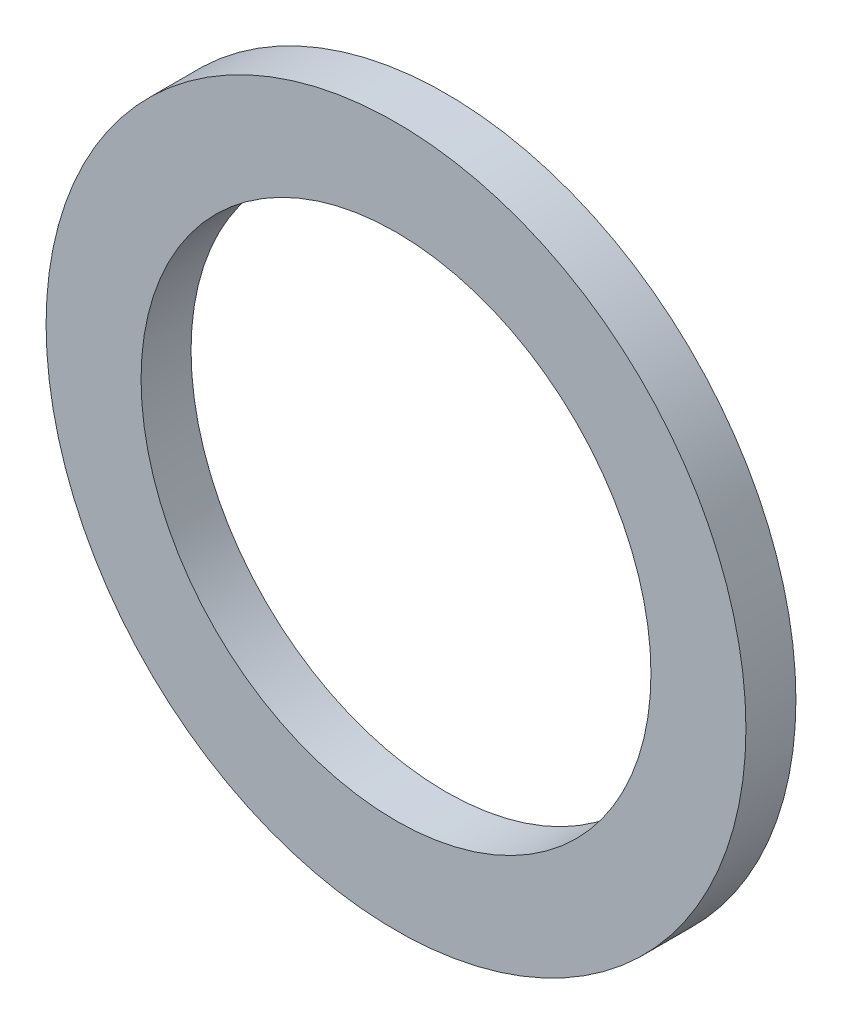
ISO-10303-21;
HEADER;
FILE_DESCRIPTION(('STEP AP214'),'2;1');
FILE_NAME('part.step','',(''),(''),'','','');
FILE_SCHEMA(('AUTOMOTIVE_DESIGN { 1 0 10303 214 1 1 1 1 }'));
ENDSEC;
DATA;
#1=APPLICATION_CONTEXT('core data for automotive mechanical design processes');
#2=APPLICATION_PROTOCOL_DEFINITION('international standard','automotive_design',2000,#1);
#3=PRODUCT_CONTEXT('',#1,'mechanical');
#4=PRODUCT('Part','Part','',(#3));
#5=PRODUCT_RELATED_PRODUCT_CATEGORY('part','',(#4));
#6=PRODUCT_DEFINITION_FORMATION('','',#4);
#7=PRODUCT_DEFINITION_CONTEXT('part definition',#1,'design');
#8=PRODUCT_DEFINITION('design','',#6,#7);
#9=PRODUCT_DEFINITION_SHAPE('','',#8);
#10=(LENGTH_UNIT() NAMED_UNIT(*) SI_UNIT(.MILLI.,.METRE.));
#11=(NAMED_UNIT(*) PLANE_ANGLE_UNIT() SI_UNIT($,.RADIAN.));
#12=(NAMED_UNIT(*) SI_UNIT($,.STERADIAN.) SOLID_ANGLE_UNIT());
#13=UNCERTAINTY_MEASURE_WITH_UNIT(LENGTH_MEASURE(1.E-05),#10,'distance_accuracy_value','');
#14=(GEOMETRIC_REPRESENTATION_CONTEXT(3) GLOBAL_UNCERTAINTY_ASSIGNED_CONTEXT((#13)) GLOBAL_UNIT_ASSIGNED_CONTEXT((#10,
#11,#12)) REPRESENTATION_CONTEXT('',''));
#15=CARTESIAN_POINT('',(0.,0.,0.));
#16=DIRECTION('',(0.,0.,1.));
#17=DIRECTION('',(1.,0.,0.));
#18=AXIS2_PLACEMENT_3D('',#15,#16,#17);
#19=CARTESIAN_POINT('',(0.,0.,1.));
#20=DIRECTION('',(0.,0.,1.));
#21=DIRECTION('',(1.,0.,0.));
#22=AXIS2_PLACEMENT_3D('',#19,#20,#21);
#23=PLANE('',#22);
#24=CARTESIAN_POINT('',(0.,0.,1.));
#25=DIRECTION('',(0.,0.,1.));
#26=DIRECTION('',(1.,0.,0.));
#27=AXIS2_PLACEMENT_3D('',#24,#25,#26);
#28=CIRCLE('',#27,7.);
#29=CARTESIAN_POINT('',(7.,0.,1.));
#30=VERTEX_POINT('',#29);
#31=EDGE_CURVE('E10',#30,#30,#28,.T.);
#32=ORIENTED_EDGE('',*,*,#31,.T.);
#33=EDGE_LOOP('',(#32));
#34=FACE_BOUND('',#33,.T.);
#35=CARTESIAN_POINT('',(0.,0.,1.));
#36=DIRECTION('',(0.,0.,1.));
#37=DIRECTION('',(1.,0.,0.));
#38=AXIS2_PLACEMENT_3D('',#35,#36,#37);
#39=CIRCLE('',#38,5.1);
#40=CARTESIAN_POINT('',(5.1,0.,1.));
#41=VERTEX_POINT('',#40);
#42=EDGE_CURVE('E45',#41,#41,#39,.T.);
#43=ORIENTED_EDGE('',*,*,#42,.F.);
#44=EDGE_LOOP('',(#43));
#45=FACE_BOUND('',#44,.T.);
#46=ADVANCED_FACE('F34',(#34,#45),#23,.T.);
#47=CARTESIAN_POINT('',(0.,0.,0.));
#48=DIRECTION('',(0.,0.,1.));
#49=DIRECTION('',(1.,0.,0.));
#50=AXIS2_PLACEMENT_3D('',#47,#48,#49);
#51=PLANE('',#50);
#52=CARTESIAN_POINT('',(0.,0.,0.));
#53=DIRECTION('',(0.,0.,1.));
#54=DIRECTION('',(1.,0.,0.));
#55=AXIS2_PLACEMENT_3D('',#52,#53,#54);
#56=CIRCLE('',#55,7.);
#57=CARTESIAN_POINT('',(7.,0.,0.));
#58=VERTEX_POINT('',#57);
#59=EDGE_CURVE('E38',#58,#58,#56,.T.);
#60=ORIENTED_EDGE('',*,*,#59,.F.);
#61=EDGE_LOOP('',(#60));
#62=FACE_BOUND('',#61,.T.);
#63=CARTESIAN_POINT('',(0.,0.,0.));
#64=DIRECTION('',(0.,0.,1.));
#65=DIRECTION('',(1.,0.,0.));
#66=AXIS2_PLACEMENT_3D('',#63,#64,#65);
#67=CIRCLE('',#66,5.1);
#68=CARTESIAN_POINT('',(5.1,0.,0.));
#69=VERTEX_POINT('',#68);
#70=EDGE_CURVE('E47',#69,#69,#67,.T.);
#71=ORIENTED_EDGE('',*,*,#70,.T.);
#72=EDGE_LOOP('',(#71));
#73=FACE_BOUND('',#72,.T.);
#74=ADVANCED_FACE('F57',(#62,#73),#51,.F.);
#75=CARTESIAN_POINT('',(0.,0.,1.));
#76=DIRECTION('',(0.,0.,-1.));
#77=DIRECTION('',(-1.,0.,0.));
#78=AXIS2_PLACEMENT_3D('',#75,#76,#77);
#79=CYLINDRICAL_SURFACE('',#78,7.);
#80=ORIENTED_EDGE('',*,*,#31,.F.);
#81=EDGE_LOOP('',(#80));
#82=FACE_BOUND('',#81,.T.);
#83=ORIENTED_EDGE('',*,*,#59,.T.);
#84=EDGE_LOOP('',(#83));
#85=FACE_BOUND('',#84,.T.);
#86=ADVANCED_FACE('F36',(#82,#85),#79,.T.);
#87=CARTESIAN_POINT('',(0.,0.,1.));
#88=DIRECTION('',(0.,0.,-1.));
#89=DIRECTION('',(-1.,0.,0.));
#90=AXIS2_PLACEMENT_3D('',#87,#88,#89);
#91=CYLINDRICAL_SURFACE('',#90,5.1);
#92=ORIENTED_EDGE('',*,*,#42,.T.);
#93=EDGE_LOOP('',(#92));
#94=FACE_BOUND('',#93,.T.);
#95=ORIENTED_EDGE('',*,*,#70,.F.);
#96=EDGE_LOOP('',(#95));
#97=FACE_BOUND('',#96,.T.);
#98=ADVANCED_FACE('F53',(#94,#97),#91,.F.);
#99=CLOSED_SHELL('',(#46,#74,#86,#98));
#100=MANIFOLD_SOLID_BREP('B2',#99);
#101=ADVANCED_BREP_SHAPE_REPRESENTATION('',(#18,#100),#14);
#102=SHAPE_DEFINITION_REPRESENTATION(#9,#101);
ENDSEC;
END-ISO-10303-21;
